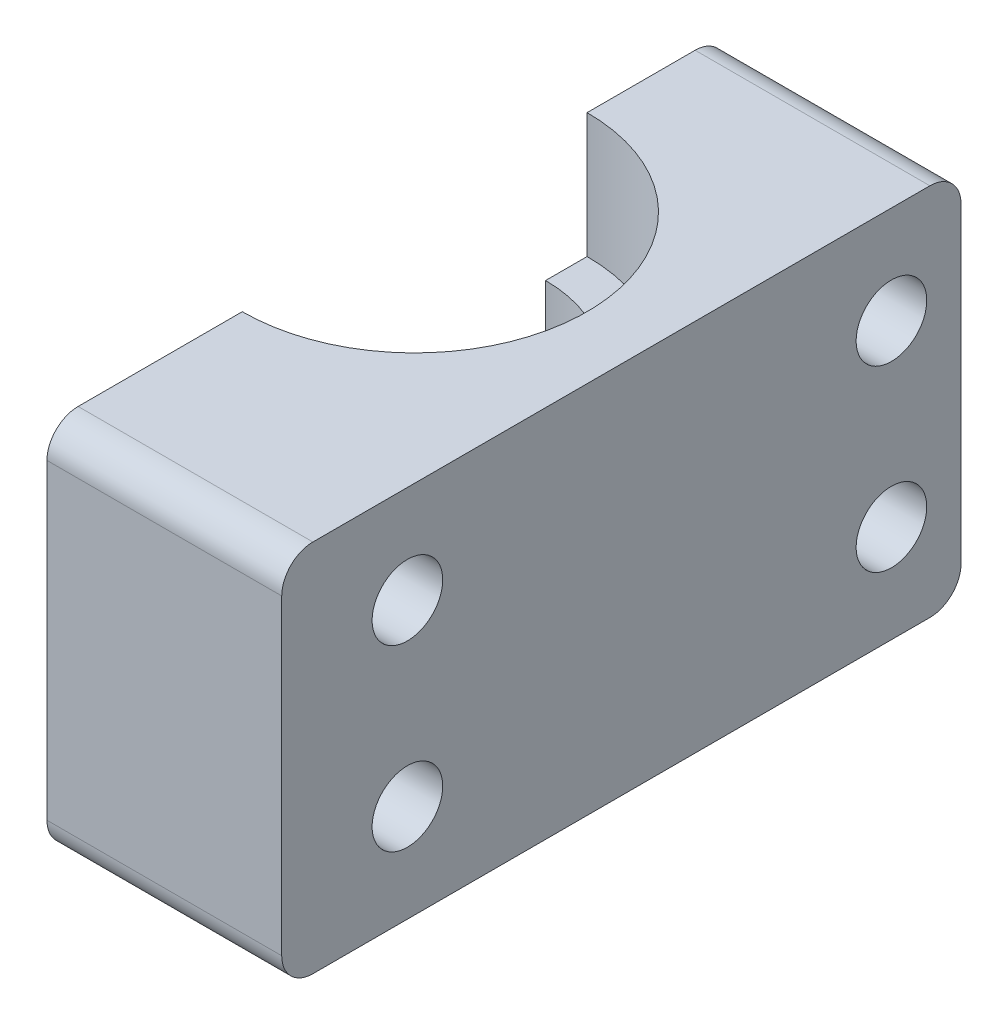
ISO-10303-21;
HEADER;
FILE_DESCRIPTION(('STEP AP214'),'2;1');
FILE_NAME('part.step','',(''),(''),'','','');
FILE_SCHEMA(('AUTOMOTIVE_DESIGN { 1 0 10303 214 1 1 1 1 }'));
ENDSEC;
DATA;
#1=APPLICATION_CONTEXT('core data for automotive mechanical design processes');
#2=APPLICATION_PROTOCOL_DEFINITION('international standard','automotive_design',2000,#1);
#3=PRODUCT_CONTEXT('',#1,'mechanical');
#4=PRODUCT('Part','Part','',(#3));
#5=PRODUCT_RELATED_PRODUCT_CATEGORY('part','',(#4));
#6=PRODUCT_DEFINITION_FORMATION('','',#4);
#7=PRODUCT_DEFINITION_CONTEXT('part definition',#1,'design');
#8=PRODUCT_DEFINITION('design','',#6,#7);
#9=PRODUCT_DEFINITION_SHAPE('','',#8);
#10=(LENGTH_UNIT() NAMED_UNIT(*) SI_UNIT(.MILLI.,.METRE.));
#11=(NAMED_UNIT(*) PLANE_ANGLE_UNIT() SI_UNIT($,.RADIAN.));
#12=(NAMED_UNIT(*) SI_UNIT($,.STERADIAN.) SOLID_ANGLE_UNIT());
#13=UNCERTAINTY_MEASURE_WITH_UNIT(LENGTH_MEASURE(1.E-05),#10,'distance_accuracy_value','');
#14=(GEOMETRIC_REPRESENTATION_CONTEXT(3) GLOBAL_UNCERTAINTY_ASSIGNED_CONTEXT((#13)) GLOBAL_UNIT_ASSIGNED_CONTEXT((#10,
#11,#12)) REPRESENTATION_CONTEXT('',''));
#15=CARTESIAN_POINT('',(0.,0.,0.));
#16=DIRECTION('',(0.,0.,1.));
#17=DIRECTION('',(1.,0.,0.));
#18=AXIS2_PLACEMENT_3D('',#15,#16,#17);
#19=CARTESIAN_POINT('',(100.,50.,-15.));
#20=DIRECTION('',(0.,0.,1.));
#21=DIRECTION('',(0.,-1.,0.));
#22=AXIS2_PLACEMENT_3D('',#19,#20,#21);
#23=PLANE('',#22);
#24=DIRECTION('',(0.,1.,0.));
#25=VECTOR('',#24,1.);
#26=CARTESIAN_POINT('',(0.,50.,-15.));
#27=LINE('',#26,#25);
#28=CARTESIAN_POINT('',(0.,-7.49999999999999,-15.));
#29=VERTEX_POINT('',#28);
#30=CARTESIAN_POINT('',(0.,7.49999999999999,-15.));
#31=VERTEX_POINT('',#30);
#32=EDGE_CURVE('E177',#29,#31,#27,.T.);
#33=ORIENTED_EDGE('',*,*,#32,.T.);
#34=DIRECTION('',(-1.,0.,0.));
#35=VECTOR('',#34,1.);
#36=CARTESIAN_POINT('',(11.3,7.49999999999999,-15.));
#37=LINE('',#36,#35);
#38=CARTESIAN_POINT('',(11.3,7.49999999999999,-15.));
#39=VERTEX_POINT('',#38);
#40=EDGE_CURVE('E192',#31,#39,#37,.F.);
#41=ORIENTED_EDGE('',*,*,#40,.T.);
#42=DIRECTION('',(0.,1.,0.));
#43=VECTOR('',#42,1.);
#44=CARTESIAN_POINT('',(11.3,-9.,-15.));
#45=LINE('',#44,#43);
#46=CARTESIAN_POINT('',(11.3,-7.49999999999999,-15.));
#47=VERTEX_POINT('',#46);
#48=EDGE_CURVE('E179',#47,#39,#45,.T.);
#49=ORIENTED_EDGE('',*,*,#48,.F.);
#50=DIRECTION('',(1.,0.,0.));
#51=VECTOR('',#50,1.);
#52=CARTESIAN_POINT('',(0.,-7.49999999999999,-15.));
#53=LINE('',#52,#51);
#54=EDGE_CURVE('E190',#47,#29,#53,.F.);
#55=ORIENTED_EDGE('',*,*,#54,.T.);
#56=EDGE_LOOP('',(#33,#41,#49,#55));
#57=FACE_BOUND('',#56,.T.);
#58=ADVANCED_FACE('F36',(#57),#23,.F.);
#59=CARTESIAN_POINT('',(100.,50.,17.7));
#60=DIRECTION('',(0.,0.,-1.));
#61=DIRECTION('',(0.,1.,0.));
#62=AXIS2_PLACEMENT_3D('',#59,#60,#61);
#63=PLANE('',#62);
#64=DIRECTION('',(0.,-1.,0.));
#65=VECTOR('',#64,1.);
#66=CARTESIAN_POINT('',(0.,50.,17.7));
#67=LINE('',#66,#65);
#68=CARTESIAN_POINT('',(0.,7.49999999999999,17.7));
#69=VERTEX_POINT('',#68);
#70=CARTESIAN_POINT('',(0.,-7.49999999999999,17.7));
#71=VERTEX_POINT('',#70);
#72=EDGE_CURVE('E175',#69,#71,#67,.T.);
#73=ORIENTED_EDGE('',*,*,#72,.T.);
#74=DIRECTION('',(-1.,0.,0.));
#75=VECTOR('',#74,1.);
#76=CARTESIAN_POINT('',(11.3,-7.49999999999999,17.7));
#77=LINE('',#76,#75);
#78=CARTESIAN_POINT('',(11.3,-7.49999999999999,17.7));
#79=VERTEX_POINT('',#78);
#80=EDGE_CURVE('E12',#71,#79,#77,.F.);
#81=ORIENTED_EDGE('',*,*,#80,.T.);
#82=DIRECTION('',(0.,1.,0.));
#83=VECTOR('',#82,1.);
#84=CARTESIAN_POINT('',(11.3,-9.,17.7));
#85=LINE('',#84,#83);
#86=CARTESIAN_POINT('',(11.3,7.49999999999999,17.7));
#87=VERTEX_POINT('',#86);
#88=EDGE_CURVE('E157',#79,#87,#85,.T.);
#89=ORIENTED_EDGE('',*,*,#88,.T.);
#90=DIRECTION('',(1.,0.,0.));
#91=VECTOR('',#90,1.);
#92=CARTESIAN_POINT('',(0.,7.49999999999999,17.7));
#93=LINE('',#92,#91);
#94=EDGE_CURVE('E44',#87,#69,#93,.F.);
#95=ORIENTED_EDGE('',*,*,#94,.T.);
#96=EDGE_LOOP('',(#73,#81,#89,#95));
#97=FACE_BOUND('',#96,.T.);
#98=ADVANCED_FACE('F227',(#97),#63,.F.);
#99=CARTESIAN_POINT('',(0.,0.,0.));
#100=DIRECTION('',(1.,0.,0.));
#101=DIRECTION('',(0.,0.,-1.));
#102=AXIS2_PLACEMENT_3D('',#99,#100,#101);
#103=PLANE('',#102);
#104=CARTESIAN_POINT('',(0.,4.29999999999999,11.65));
#105=DIRECTION('',(-1.,0.,0.));
#106=DIRECTION('',(0.,0.,1.));
#107=AXIS2_PLACEMENT_3D('',#104,#105,#106);
#108=CIRCLE('',#107,1.7);
#109=CARTESIAN_POINT('',(0.,4.29999999999999,13.35));
#110=VERTEX_POINT('',#109);
#111=EDGE_CURVE('E354',#110,#110,#108,.T.);
#112=ORIENTED_EDGE('',*,*,#111,.F.);
#113=EDGE_LOOP('',(#112));
#114=FACE_BOUND('',#113,.T.);
#115=CARTESIAN_POINT('',(0.,-4.29999999999999,11.65));
#116=DIRECTION('',(-1.,0.,0.));
#117=DIRECTION('',(0.,0.,1.));
#118=AXIS2_PLACEMENT_3D('',#115,#116,#117);
#119=CIRCLE('',#118,1.7);
#120=CARTESIAN_POINT('',(0.,-4.29999999999999,13.35));
#121=VERTEX_POINT('',#120);
#122=EDGE_CURVE('E347',#121,#121,#119,.T.);
#123=ORIENTED_EDGE('',*,*,#122,.F.);
#124=EDGE_LOOP('',(#123));
#125=FACE_BOUND('',#124,.T.);
#126=DIRECTION('',(0.,0.,-1.));
#127=VECTOR('',#126,1.);
#128=CARTESIAN_POINT('',(0.,-8.99999999999999,0.));
#129=LINE('',#128,#127);
#130=CARTESIAN_POINT('',(0.,-8.99999999999999,16.2));
#131=VERTEX_POINT('',#130);
#132=CARTESIAN_POINT('',(0.,-9.,8.3));
#133=VERTEX_POINT('',#132);
#134=EDGE_CURVE('E135',#131,#133,#129,.T.);
#135=ORIENTED_EDGE('',*,*,#134,.F.);
#136=CARTESIAN_POINT('',(0.,-7.49999999999999,16.2));
#137=DIRECTION('',(1.,0.,0.));
#138=DIRECTION('',(0.,0.,-1.));
#139=AXIS2_PLACEMENT_3D('',#136,#137,#138);
#140=CIRCLE('',#139,1.5);
#141=EDGE_CURVE('E51',#131,#71,#140,.F.);
#142=ORIENTED_EDGE('',*,*,#141,.T.);
#143=ORIENTED_EDGE('',*,*,#72,.F.);
#144=CARTESIAN_POINT('',(0.,7.49999999999999,16.2));
#145=DIRECTION('',(1.,0.,0.));
#146=DIRECTION('',(0.,0.,-1.));
#147=AXIS2_PLACEMENT_3D('',#144,#145,#146);
#148=CIRCLE('',#147,1.5);
#149=CARTESIAN_POINT('',(0.,8.99999999999999,16.2));
#150=VERTEX_POINT('',#149);
#151=EDGE_CURVE('E206',#69,#150,#148,.F.);
#152=ORIENTED_EDGE('',*,*,#151,.T.);
#153=DIRECTION('',(0.,0.,1.));
#154=VECTOR('',#153,1.);
#155=CARTESIAN_POINT('',(0.,8.99999999999999,0.));
#156=LINE('',#155,#154);
#157=CARTESIAN_POINT('',(0.,9.,8.3));
#158=VERTEX_POINT('',#157);
#159=EDGE_CURVE('E174',#158,#150,#156,.T.);
#160=ORIENTED_EDGE('',*,*,#159,.F.);
#161=DIRECTION('',(0.,-1.,0.));
#162=VECTOR('',#161,1.);
#163=CARTESIAN_POINT('',(0.,-50.,8.3));
#164=LINE('',#163,#162);
#165=CARTESIAN_POINT('',(0.,3.,8.3));
#166=VERTEX_POINT('',#165);
#167=EDGE_CURVE('E172',#166,#158,#164,.F.);
#168=ORIENTED_EDGE('',*,*,#167,.F.);
#169=DIRECTION('',(0.,0.,1.));
#170=VECTOR('',#169,1.);
#171=CARTESIAN_POINT('',(0.,3.,0.));
#172=LINE('',#171,#170);
#173=CARTESIAN_POINT('',(0.,3.,6.3));
#174=VERTEX_POINT('',#173);
#175=EDGE_CURVE('E171',#174,#166,#172,.T.);
#176=ORIENTED_EDGE('',*,*,#175,.F.);
#177=DIRECTION('',(0.,-1.,0.));
#178=VECTOR('',#177,1.);
#179=CARTESIAN_POINT('',(0.,-50.,6.3));
#180=LINE('',#179,#178);
#181=CARTESIAN_POINT('',(0.,-3.,6.3));
#182=VERTEX_POINT('',#181);
#183=EDGE_CURVE('E164',#182,#174,#180,.F.);
#184=ORIENTED_EDGE('',*,*,#183,.F.);
#185=DIRECTION('',(0.,0.,-1.));
#186=VECTOR('',#185,1.);
#187=CARTESIAN_POINT('',(0.,-3.,0.));
#188=LINE('',#187,#186);
#189=CARTESIAN_POINT('',(0.,-3.,8.3));
#190=VERTEX_POINT('',#189);
#191=EDGE_CURVE('E162',#190,#182,#188,.T.);
#192=ORIENTED_EDGE('',*,*,#191,.F.);
#193=DIRECTION('',(0.,-1.,0.));
#194=VECTOR('',#193,1.);
#195=CARTESIAN_POINT('',(0.,-50.,8.3));
#196=LINE('',#195,#194);
#197=EDGE_CURVE('E145',#133,#190,#196,.F.);
#198=ORIENTED_EDGE('',*,*,#197,.F.);
#199=EDGE_LOOP('',(#135,#142,#143,#152,#160,#168,#176,#184,#192,#198));
#200=FACE_BOUND('',#199,.T.);
#201=ADVANCED_FACE('F160',(#114,#125,#200),#103,.F.);
#202=CARTESIAN_POINT('',(0.,-4.29999999999999,-11.65));
#203=DIRECTION('',(-1.,0.,0.));
#204=DIRECTION('',(0.,0.,1.));
#205=AXIS2_PLACEMENT_3D('',#202,#203,#204);
#206=CIRCLE('',#205,1.7);
#207=CARTESIAN_POINT('',(0.,-4.29999999999999,-9.95));
#208=VERTEX_POINT('',#207);
#209=EDGE_CURVE('E351',#208,#208,#206,.T.);
#210=ORIENTED_EDGE('',*,*,#209,.F.);
#211=EDGE_LOOP('',(#210));
#212=FACE_BOUND('',#211,.T.);
#213=CARTESIAN_POINT('',(0.,4.29999999999999,-11.65));
#214=DIRECTION('',(-1.,0.,0.));
#215=DIRECTION('',(0.,0.,1.));
#216=AXIS2_PLACEMENT_3D('',#213,#214,#215);
#217=CIRCLE('',#216,1.7);
#218=CARTESIAN_POINT('',(0.,4.29999999999999,-9.95));
#219=VERTEX_POINT('',#218);
#220=EDGE_CURVE('E239',#219,#219,#217,.T.);
#221=ORIENTED_EDGE('',*,*,#220,.F.);
#222=EDGE_LOOP('',(#221));
#223=FACE_BOUND('',#222,.T.);
#224=CARTESIAN_POINT('',(0.,8.99999999999999,-13.5));
#225=VERTEX_POINT('',#224);
#226=CARTESIAN_POINT('',(0.,9.,-8.3));
#227=VERTEX_POINT('',#226);
#228=EDGE_CURVE('E146',#225,#227,#156,.T.);
#229=ORIENTED_EDGE('',*,*,#228,.F.);
#230=CARTESIAN_POINT('',(0.,7.49999999999999,-13.5));
#231=DIRECTION('',(1.,0.,0.));
#232=DIRECTION('',(0.,0.,-1.));
#233=AXIS2_PLACEMENT_3D('',#230,#231,#232);
#234=CIRCLE('',#233,1.5);
#235=EDGE_CURVE('E188',#225,#31,#234,.F.);
#236=ORIENTED_EDGE('',*,*,#235,.T.);
#237=ORIENTED_EDGE('',*,*,#32,.F.);
#238=CARTESIAN_POINT('',(0.,-7.49999999999999,-13.5));
#239=DIRECTION('',(1.,0.,0.));
#240=DIRECTION('',(0.,0.,-1.));
#241=AXIS2_PLACEMENT_3D('',#238,#239,#240);
#242=CIRCLE('',#241,1.5);
#243=CARTESIAN_POINT('',(0.,-8.99999999999999,-13.5));
#244=VERTEX_POINT('',#243);
#245=EDGE_CURVE('E186',#29,#244,#242,.F.);
#246=ORIENTED_EDGE('',*,*,#245,.T.);
#247=CARTESIAN_POINT('',(0.,-9.,-8.3));
#248=VERTEX_POINT('',#247);
#249=EDGE_CURVE('E148',#248,#244,#129,.T.);
#250=ORIENTED_EDGE('',*,*,#249,.F.);
#251=DIRECTION('',(0.,-1.,0.));
#252=VECTOR('',#251,1.);
#253=CARTESIAN_POINT('',(0.,-50.,-8.3));
#254=LINE('',#253,#252);
#255=CARTESIAN_POINT('',(0.,-3.,-8.3));
#256=VERTEX_POINT('',#255);
#257=EDGE_CURVE('E154',#256,#248,#254,.T.);
#258=ORIENTED_EDGE('',*,*,#257,.F.);
#259=CARTESIAN_POINT('',(0.,-3.,-6.3));
#260=VERTEX_POINT('',#259);
#261=EDGE_CURVE('E166',#260,#256,#188,.T.);
#262=ORIENTED_EDGE('',*,*,#261,.F.);
#263=DIRECTION('',(0.,-1.,0.));
#264=VECTOR('',#263,1.);
#265=CARTESIAN_POINT('',(0.,-50.,-6.3));
#266=LINE('',#265,#264);
#267=CARTESIAN_POINT('',(0.,3.,-6.3));
#268=VERTEX_POINT('',#267);
#269=EDGE_CURVE('E256',#268,#260,#266,.T.);
#270=ORIENTED_EDGE('',*,*,#269,.F.);
#271=CARTESIAN_POINT('',(0.,3.,-8.3));
#272=VERTEX_POINT('',#271);
#273=EDGE_CURVE('E258',#272,#268,#172,.T.);
#274=ORIENTED_EDGE('',*,*,#273,.F.);
#275=DIRECTION('',(0.,-1.,0.));
#276=VECTOR('',#275,1.);
#277=CARTESIAN_POINT('',(0.,-50.,-8.3));
#278=LINE('',#277,#276);
#279=EDGE_CURVE('E259',#227,#272,#278,.T.);
#280=ORIENTED_EDGE('',*,*,#279,.F.);
#281=EDGE_LOOP('',(#229,#236,#237,#246,#250,#258,#262,#270,#274,#280));
#282=FACE_BOUND('',#281,.T.);
#283=ADVANCED_FACE('F268',(#212,#223,#282),#103,.F.);
#284=CARTESIAN_POINT('',(0.,8.99999999999999,8.3));
#285=DIRECTION('',(0.,1.,0.));
#286=DIRECTION('',(0.,0.,1.));
#287=AXIS2_PLACEMENT_3D('',#284,#285,#286);
#288=PLANE('',#287);
#289=DIRECTION('',(0.,0.,1.));
#290=VECTOR('',#289,1.);
#291=CARTESIAN_POINT('',(11.3,8.99999999999999,15.));
#292=LINE('',#291,#290);
#293=CARTESIAN_POINT('',(11.3,8.99999999999999,-13.5));
#294=VERTEX_POINT('',#293);
#295=CARTESIAN_POINT('',(11.3,8.99999999999999,16.2));
#296=VERTEX_POINT('',#295);
#297=EDGE_CURVE('E226',#294,#296,#292,.T.);
#298=ORIENTED_EDGE('',*,*,#297,.F.);
#299=DIRECTION('',(-1.,0.,0.));
#300=VECTOR('',#299,1.);
#301=CARTESIAN_POINT('',(0.,8.99999999999999,-13.5));
#302=LINE('',#301,#300);
#303=EDGE_CURVE('E183',#294,#225,#302,.T.);
#304=ORIENTED_EDGE('',*,*,#303,.T.);
#305=ORIENTED_EDGE('',*,*,#228,.T.);
#306=CARTESIAN_POINT('',(0.,9.,0.));
#307=DIRECTION('',(0.,-1.,0.));
#308=DIRECTION('',(0.,0.,-1.));
#309=AXIS2_PLACEMENT_3D('',#306,#307,#308);
#310=CIRCLE('',#309,8.3);
#311=EDGE_CURVE('E220',#227,#158,#310,.T.);
#312=ORIENTED_EDGE('',*,*,#311,.T.);
#313=ORIENTED_EDGE('',*,*,#159,.T.);
#314=DIRECTION('',(1.,0.,0.));
#315=VECTOR('',#314,1.);
#316=CARTESIAN_POINT('',(11.3,8.99999999999999,16.2));
#317=LINE('',#316,#315);
#318=EDGE_CURVE('E180',#150,#296,#317,.T.);
#319=ORIENTED_EDGE('',*,*,#318,.T.);
#320=EDGE_LOOP('',(#298,#304,#305,#312,#313,#319));
#321=FACE_BOUND('',#320,.T.);
#322=ADVANCED_FACE('F217',(#321),#288,.T.);
#323=CARTESIAN_POINT('',(0.,-50.,0.));
#324=DIRECTION('',(0.,-1.,0.));
#325=DIRECTION('',(0.,0.,-1.));
#326=AXIS2_PLACEMENT_3D('',#323,#324,#325);
#327=CYLINDRICAL_SURFACE('',#326,8.3);
#328=ORIENTED_EDGE('',*,*,#167,.T.);
#329=ORIENTED_EDGE('',*,*,#311,.F.);
#330=ORIENTED_EDGE('',*,*,#279,.T.);
#331=CARTESIAN_POINT('',(0.,3.,0.));
#332=DIRECTION('',(0.,-1.,0.));
#333=DIRECTION('',(0.,0.,-1.));
#334=AXIS2_PLACEMENT_3D('',#331,#332,#333);
#335=CIRCLE('',#334,8.3);
#336=EDGE_CURVE('E249',#272,#166,#335,.T.);
#337=ORIENTED_EDGE('',*,*,#336,.T.);
#338=EDGE_LOOP('',(#328,#329,#330,#337));
#339=FACE_BOUND('',#338,.T.);
#340=ADVANCED_FACE('F266',(#339),#327,.F.);
#341=CARTESIAN_POINT('',(0.,3.,8.3));
#342=DIRECTION('',(0.,1.,0.));
#343=DIRECTION('',(0.,0.,1.));
#344=AXIS2_PLACEMENT_3D('',#341,#342,#343);
#345=PLANE('',#344);
#346=ORIENTED_EDGE('',*,*,#273,.T.);
#347=CARTESIAN_POINT('',(0.,3.,0.));
#348=DIRECTION('',(0.,-1.,0.));
#349=DIRECTION('',(0.,0.,-1.));
#350=AXIS2_PLACEMENT_3D('',#347,#348,#349);
#351=CIRCLE('',#350,6.3);
#352=EDGE_CURVE('E246',#268,#174,#351,.T.);
#353=ORIENTED_EDGE('',*,*,#352,.T.);
#354=ORIENTED_EDGE('',*,*,#175,.T.);
#355=ORIENTED_EDGE('',*,*,#336,.F.);
#356=EDGE_LOOP('',(#346,#353,#354,#355));
#357=FACE_BOUND('',#356,.T.);
#358=ADVANCED_FACE('F273',(#357),#345,.T.);
#359=CARTESIAN_POINT('',(0.,-50.,0.));
#360=DIRECTION('',(0.,-1.,0.));
#361=DIRECTION('',(0.,0.,-1.));
#362=AXIS2_PLACEMENT_3D('',#359,#360,#361);
#363=CYLINDRICAL_SURFACE('',#362,6.3);
#364=ORIENTED_EDGE('',*,*,#183,.T.);
#365=ORIENTED_EDGE('',*,*,#352,.F.);
#366=ORIENTED_EDGE('',*,*,#269,.T.);
#367=CARTESIAN_POINT('',(0.,-3.,0.));
#368=DIRECTION('',(0.,-1.,0.));
#369=DIRECTION('',(0.,0.,-1.));
#370=AXIS2_PLACEMENT_3D('',#367,#368,#369);
#371=CIRCLE('',#370,6.3);
#372=EDGE_CURVE('E243',#260,#182,#371,.T.);
#373=ORIENTED_EDGE('',*,*,#372,.T.);
#374=EDGE_LOOP('',(#364,#365,#366,#373));
#375=FACE_BOUND('',#374,.T.);
#376=ADVANCED_FACE('F276',(#375),#363,.F.);
#377=CARTESIAN_POINT('',(0.,-3.,6.3));
#378=DIRECTION('',(0.,-1.,0.));
#379=DIRECTION('',(0.,0.,-1.));
#380=AXIS2_PLACEMENT_3D('',#377,#378,#379);
#381=PLANE('',#380);
#382=ORIENTED_EDGE('',*,*,#191,.T.);
#383=ORIENTED_EDGE('',*,*,#372,.F.);
#384=ORIENTED_EDGE('',*,*,#261,.T.);
#385=CARTESIAN_POINT('',(0.,-3.,0.));
#386=DIRECTION('',(0.,-1.,0.));
#387=DIRECTION('',(0.,0.,-1.));
#388=AXIS2_PLACEMENT_3D('',#385,#386,#387);
#389=CIRCLE('',#388,8.3);
#390=EDGE_CURVE('E156',#256,#190,#389,.T.);
#391=ORIENTED_EDGE('',*,*,#390,.T.);
#392=EDGE_LOOP('',(#382,#383,#384,#391));
#393=FACE_BOUND('',#392,.T.);
#394=ADVANCED_FACE('F279',(#393),#381,.T.);
#395=CARTESIAN_POINT('',(0.,-50.,0.));
#396=DIRECTION('',(0.,-1.,0.));
#397=DIRECTION('',(0.,0.,-1.));
#398=AXIS2_PLACEMENT_3D('',#395,#396,#397);
#399=CYLINDRICAL_SURFACE('',#398,8.3);
#400=ORIENTED_EDGE('',*,*,#197,.T.);
#401=ORIENTED_EDGE('',*,*,#390,.F.);
#402=ORIENTED_EDGE('',*,*,#257,.T.);
#403=CARTESIAN_POINT('',(0.,-9.,0.));
#404=DIRECTION('',(0.,-1.,0.));
#405=DIRECTION('',(0.,0.,-1.));
#406=AXIS2_PLACEMENT_3D('',#403,#404,#405);
#407=CIRCLE('',#406,8.3);
#408=EDGE_CURVE('E139',#248,#133,#407,.T.);
#409=ORIENTED_EDGE('',*,*,#408,.T.);
#410=EDGE_LOOP('',(#400,#401,#402,#409));
#411=FACE_BOUND('',#410,.T.);
#412=ADVANCED_FACE('F150',(#411),#399,.F.);
#413=CARTESIAN_POINT('',(0.,-8.99999999999999,8.3));
#414=DIRECTION('',(0.,-1.,0.));
#415=DIRECTION('',(0.,0.,-1.));
#416=AXIS2_PLACEMENT_3D('',#413,#414,#415);
#417=PLANE('',#416);
#418=ORIENTED_EDGE('',*,*,#249,.T.);
#419=DIRECTION('',(1.,0.,0.));
#420=VECTOR('',#419,1.);
#421=CARTESIAN_POINT('',(11.3,-8.99999999999999,-13.5));
#422=LINE('',#421,#420);
#423=CARTESIAN_POINT('',(11.3,-9.,-13.5));
#424=VERTEX_POINT('',#423);
#425=EDGE_CURVE('E203',#244,#424,#422,.T.);
#426=ORIENTED_EDGE('',*,*,#425,.T.);
#427=DIRECTION('',(0.,0.,1.));
#428=VECTOR('',#427,1.);
#429=CARTESIAN_POINT('',(11.3,-9.,15.));
#430=LINE('',#429,#428);
#431=CARTESIAN_POINT('',(11.3,-9.,16.2));
#432=VERTEX_POINT('',#431);
#433=EDGE_CURVE('E232',#424,#432,#430,.T.);
#434=ORIENTED_EDGE('',*,*,#433,.T.);
#435=DIRECTION('',(-1.,0.,0.));
#436=VECTOR('',#435,1.);
#437=CARTESIAN_POINT('',(0.,-8.99999999999999,16.2));
#438=LINE('',#437,#436);
#439=EDGE_CURVE('E143',#432,#131,#438,.T.);
#440=ORIENTED_EDGE('',*,*,#439,.T.);
#441=ORIENTED_EDGE('',*,*,#134,.T.);
#442=ORIENTED_EDGE('',*,*,#408,.F.);
#443=EDGE_LOOP('',(#418,#426,#434,#440,#441,#442));
#444=FACE_BOUND('',#443,.T.);
#445=ADVANCED_FACE('F138',(#444),#417,.T.);
#446=CARTESIAN_POINT('',(11.3,-9.,15.));
#447=DIRECTION('',(-1.,0.,0.));
#448=DIRECTION('',(0.,0.,1.));
#449=AXIS2_PLACEMENT_3D('',#446,#447,#448);
#450=PLANE('',#449);
#451=CARTESIAN_POINT('',(11.3,4.29999999999999,11.65));
#452=DIRECTION('',(-1.,0.,0.));
#453=DIRECTION('',(0.,0.,1.));
#454=AXIS2_PLACEMENT_3D('',#451,#452,#453);
#455=CIRCLE('',#454,1.7);
#456=CARTESIAN_POINT('',(11.3,4.29999999999999,13.35));
#457=VERTEX_POINT('',#456);
#458=EDGE_CURVE('E349',#457,#457,#455,.T.);
#459=ORIENTED_EDGE('',*,*,#458,.T.);
#460=EDGE_LOOP('',(#459));
#461=FACE_BOUND('',#460,.T.);
#462=CARTESIAN_POINT('',(11.3,-4.29999999999999,11.65));
#463=DIRECTION('',(-1.,0.,0.));
#464=DIRECTION('',(0.,0.,1.));
#465=AXIS2_PLACEMENT_3D('',#462,#463,#464);
#466=CIRCLE('',#465,1.7);
#467=CARTESIAN_POINT('',(11.3,-4.29999999999999,13.35));
#468=VERTEX_POINT('',#467);
#469=EDGE_CURVE('E344',#468,#468,#466,.T.);
#470=ORIENTED_EDGE('',*,*,#469,.T.);
#471=EDGE_LOOP('',(#470));
#472=FACE_BOUND('',#471,.T.);
#473=CARTESIAN_POINT('',(11.3,-4.29999999999999,-11.65));
#474=DIRECTION('',(-1.,0.,0.));
#475=DIRECTION('',(0.,0.,1.));
#476=AXIS2_PLACEMENT_3D('',#473,#474,#475);
#477=CIRCLE('',#476,1.7);
#478=CARTESIAN_POINT('',(11.3,-4.29999999999999,-9.95));
#479=VERTEX_POINT('',#478);
#480=EDGE_CURVE('E358',#479,#479,#477,.T.);
#481=ORIENTED_EDGE('',*,*,#480,.T.);
#482=EDGE_LOOP('',(#481));
#483=FACE_BOUND('',#482,.T.);
#484=CARTESIAN_POINT('',(11.3,4.29999999999999,-11.65));
#485=DIRECTION('',(-1.,0.,0.));
#486=DIRECTION('',(0.,0.,1.));
#487=AXIS2_PLACEMENT_3D('',#484,#485,#486);
#488=CIRCLE('',#487,1.7);
#489=CARTESIAN_POINT('',(11.3,4.29999999999999,-9.95));
#490=VERTEX_POINT('',#489);
#491=EDGE_CURVE('E236',#490,#490,#488,.T.);
#492=ORIENTED_EDGE('',*,*,#491,.T.);
#493=EDGE_LOOP('',(#492));
#494=FACE_BOUND('',#493,.T.);
#495=ORIENTED_EDGE('',*,*,#48,.T.);
#496=CARTESIAN_POINT('',(11.3,7.49999999999999,-13.5));
#497=DIRECTION('',(-1.,0.,0.));
#498=DIRECTION('',(0.,0.,1.));
#499=AXIS2_PLACEMENT_3D('',#496,#497,#498);
#500=CIRCLE('',#499,1.5);
#501=EDGE_CURVE('E200',#39,#294,#500,.F.);
#502=ORIENTED_EDGE('',*,*,#501,.T.);
#503=ORIENTED_EDGE('',*,*,#297,.T.);
#504=CARTESIAN_POINT('',(11.3,7.49999999999999,16.2));
#505=DIRECTION('',(-1.,0.,0.));
#506=DIRECTION('',(0.,0.,1.));
#507=AXIS2_PLACEMENT_3D('',#504,#505,#506);
#508=CIRCLE('',#507,1.5);
#509=EDGE_CURVE('E194',#296,#87,#508,.F.);
#510=ORIENTED_EDGE('',*,*,#509,.T.);
#511=ORIENTED_EDGE('',*,*,#88,.F.);
#512=CARTESIAN_POINT('',(11.3,-7.49999999999999,16.2));
#513=DIRECTION('',(-1.,0.,0.));
#514=DIRECTION('',(0.,0.,1.));
#515=AXIS2_PLACEMENT_3D('',#512,#513,#514);
#516=CIRCLE('',#515,1.5);
#517=EDGE_CURVE('E196',#79,#432,#516,.F.);
#518=ORIENTED_EDGE('',*,*,#517,.T.);
#519=ORIENTED_EDGE('',*,*,#433,.F.);
#520=CARTESIAN_POINT('',(11.3,-7.49999999999999,-13.5));
#521=DIRECTION('',(-1.,0.,0.));
#522=DIRECTION('',(0.,0.,1.));
#523=AXIS2_PLACEMENT_3D('',#520,#521,#522);
#524=CIRCLE('',#523,1.5);
#525=EDGE_CURVE('E198',#424,#47,#524,.F.);
#526=ORIENTED_EDGE('',*,*,#525,.T.);
#527=EDGE_LOOP('',(#495,#502,#503,#510,#511,#518,#519,#526));
#528=FACE_BOUND('',#527,.T.);
#529=ADVANCED_FACE('F224',(#461,#472,#483,#494,#528),#450,.F.);
#530=CARTESIAN_POINT('',(11.3,4.29999999999999,-11.65));
#531=DIRECTION('',(-1.,0.,0.));
#532=DIRECTION('',(0.,0.,1.));
#533=AXIS2_PLACEMENT_3D('',#530,#531,#532);
#534=CYLINDRICAL_SURFACE('',#533,1.7);
#535=ORIENTED_EDGE('',*,*,#491,.F.);
#536=EDGE_LOOP('',(#535));
#537=FACE_BOUND('',#536,.T.);
#538=ORIENTED_EDGE('',*,*,#220,.T.);
#539=EDGE_LOOP('',(#538));
#540=FACE_BOUND('',#539,.T.);
#541=ADVANCED_FACE('F328',(#537,#540),#534,.F.);
#542=CARTESIAN_POINT('',(11.3,-4.29999999999999,-11.65));
#543=DIRECTION('',(-1.,0.,0.));
#544=DIRECTION('',(0.,0.,1.));
#545=AXIS2_PLACEMENT_3D('',#542,#543,#544);
#546=CYLINDRICAL_SURFACE('',#545,1.7);
#547=ORIENTED_EDGE('',*,*,#480,.F.);
#548=EDGE_LOOP('',(#547));
#549=FACE_BOUND('',#548,.T.);
#550=ORIENTED_EDGE('',*,*,#209,.T.);
#551=EDGE_LOOP('',(#550));
#552=FACE_BOUND('',#551,.T.);
#553=ADVANCED_FACE('F332',(#549,#552),#546,.F.);
#554=CARTESIAN_POINT('',(11.3,-4.29999999999999,11.65));
#555=DIRECTION('',(-1.,0.,0.));
#556=DIRECTION('',(0.,0.,1.));
#557=AXIS2_PLACEMENT_3D('',#554,#555,#556);
#558=CYLINDRICAL_SURFACE('',#557,1.7);
#559=ORIENTED_EDGE('',*,*,#469,.F.);
#560=EDGE_LOOP('',(#559));
#561=FACE_BOUND('',#560,.T.);
#562=ORIENTED_EDGE('',*,*,#122,.T.);
#563=EDGE_LOOP('',(#562));
#564=FACE_BOUND('',#563,.T.);
#565=ADVANCED_FACE('F299',(#561,#564),#558,.F.);
#566=CARTESIAN_POINT('',(11.3,4.29999999999999,11.65));
#567=DIRECTION('',(-1.,0.,0.));
#568=DIRECTION('',(0.,0.,1.));
#569=AXIS2_PLACEMENT_3D('',#566,#567,#568);
#570=CYLINDRICAL_SURFACE('',#569,1.7);
#571=ORIENTED_EDGE('',*,*,#458,.F.);
#572=EDGE_LOOP('',(#571));
#573=FACE_BOUND('',#572,.T.);
#574=ORIENTED_EDGE('',*,*,#111,.T.);
#575=EDGE_LOOP('',(#574));
#576=FACE_BOUND('',#575,.T.);
#577=ADVANCED_FACE('F292',(#573,#576),#570,.F.);
#578=CARTESIAN_POINT('',(0.,7.49999999999999,-13.5));
#579=DIRECTION('',(1.,0.,0.));
#580=DIRECTION('',(0.,0.,-1.));
#581=AXIS2_PLACEMENT_3D('',#578,#579,#580);
#582=CYLINDRICAL_SURFACE('',#581,1.5);
#583=ORIENTED_EDGE('',*,*,#501,.F.);
#584=ORIENTED_EDGE('',*,*,#40,.F.);
#585=ORIENTED_EDGE('',*,*,#235,.F.);
#586=ORIENTED_EDGE('',*,*,#303,.F.);
#587=EDGE_LOOP('',(#583,#584,#585,#586));
#588=FACE_BOUND('',#587,.T.);
#589=ADVANCED_FACE('F290',(#588),#582,.T.);
#590=CARTESIAN_POINT('',(0.,-7.49999999999999,-13.5));
#591=DIRECTION('',(-1.,0.,0.));
#592=DIRECTION('',(0.,0.,1.));
#593=AXIS2_PLACEMENT_3D('',#590,#591,#592);
#594=CYLINDRICAL_SURFACE('',#593,1.5);
#595=ORIENTED_EDGE('',*,*,#245,.F.);
#596=ORIENTED_EDGE('',*,*,#54,.F.);
#597=ORIENTED_EDGE('',*,*,#525,.F.);
#598=ORIENTED_EDGE('',*,*,#425,.F.);
#599=EDGE_LOOP('',(#595,#596,#597,#598));
#600=FACE_BOUND('',#599,.T.);
#601=ADVANCED_FACE('F283',(#600),#594,.T.);
#602=CARTESIAN_POINT('',(0.,-7.49999999999999,16.2));
#603=DIRECTION('',(1.,0.,0.));
#604=DIRECTION('',(0.,0.,-1.));
#605=AXIS2_PLACEMENT_3D('',#602,#603,#604);
#606=CYLINDRICAL_SURFACE('',#605,1.5);
#607=ORIENTED_EDGE('',*,*,#517,.F.);
#608=ORIENTED_EDGE('',*,*,#80,.F.);
#609=ORIENTED_EDGE('',*,*,#141,.F.);
#610=ORIENTED_EDGE('',*,*,#439,.F.);
#611=EDGE_LOOP('',(#607,#608,#609,#610));
#612=FACE_BOUND('',#611,.T.);
#613=ADVANCED_FACE('F230',(#612),#606,.T.);
#614=CARTESIAN_POINT('',(0.,7.49999999999999,16.2));
#615=DIRECTION('',(-1.,0.,0.));
#616=DIRECTION('',(0.,0.,1.));
#617=AXIS2_PLACEMENT_3D('',#614,#615,#616);
#618=CYLINDRICAL_SURFACE('',#617,1.5);
#619=ORIENTED_EDGE('',*,*,#151,.F.);
#620=ORIENTED_EDGE('',*,*,#94,.F.);
#621=ORIENTED_EDGE('',*,*,#509,.F.);
#622=ORIENTED_EDGE('',*,*,#318,.F.);
#623=EDGE_LOOP('',(#619,#620,#621,#622));
#624=FACE_BOUND('',#623,.T.);
#625=ADVANCED_FACE('F38',(#624),#618,.T.);
#626=CLOSED_SHELL('',(#58,#98,#201,#283,#322,#340,#358,#376,#394,#412,#445,#529,#541,#553,#565,
#577,#589,#601,#613,#625));
#627=MANIFOLD_SOLID_BREP('B2',#626);
#628=ADVANCED_BREP_SHAPE_REPRESENTATION('',(#18,#627),#14);
#629=SHAPE_DEFINITION_REPRESENTATION(#9,#628);
ENDSEC;
END-ISO-10303-21;
